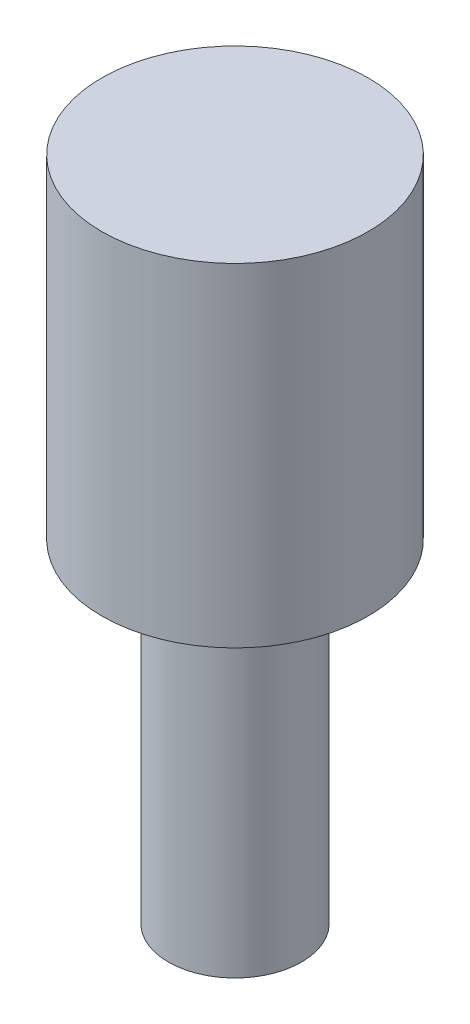
ISO-10303-21;
HEADER;
FILE_DESCRIPTION(('STEP AP214'),'2;1');
FILE_NAME('part.step','',(''),(''),'','','');
FILE_SCHEMA(('AUTOMOTIVE_DESIGN { 1 0 10303 214 1 1 1 1 }'));
ENDSEC;
DATA;
#1=APPLICATION_CONTEXT('core data for automotive mechanical design processes');
#2=APPLICATION_PROTOCOL_DEFINITION('international standard','automotive_design',2000,#1);
#3=PRODUCT_CONTEXT('',#1,'mechanical');
#4=PRODUCT('Part','Part','',(#3));
#5=PRODUCT_RELATED_PRODUCT_CATEGORY('part','',(#4));
#6=PRODUCT_DEFINITION_FORMATION('','',#4);
#7=PRODUCT_DEFINITION_CONTEXT('part definition',#1,'design');
#8=PRODUCT_DEFINITION('design','',#6,#7);
#9=PRODUCT_DEFINITION_SHAPE('','',#8);
#10=(LENGTH_UNIT() NAMED_UNIT(*) SI_UNIT(.MILLI.,.METRE.));
#11=(NAMED_UNIT(*) PLANE_ANGLE_UNIT() SI_UNIT($,.RADIAN.));
#12=(NAMED_UNIT(*) SI_UNIT($,.STERADIAN.) SOLID_ANGLE_UNIT());
#13=UNCERTAINTY_MEASURE_WITH_UNIT(LENGTH_MEASURE(1.E-05),#10,'distance_accuracy_value','');
#14=(GEOMETRIC_REPRESENTATION_CONTEXT(3) GLOBAL_UNCERTAINTY_ASSIGNED_CONTEXT((#13)) GLOBAL_UNIT_ASSIGNED_CONTEXT((#10,
#11,#12)) REPRESENTATION_CONTEXT('',''));
#15=CARTESIAN_POINT('',(0.,0.,0.));
#16=DIRECTION('',(0.,0.,1.));
#17=DIRECTION('',(1.,0.,0.));
#18=AXIS2_PLACEMENT_3D('',#15,#16,#17);
#19=CARTESIAN_POINT('',(0.,10.,0.));
#20=DIRECTION('',(0.,-1.,0.));
#21=DIRECTION('',(0.,0.,-1.));
#22=AXIS2_PLACEMENT_3D('',#19,#20,#21);
#23=CYLINDRICAL_SURFACE('',#22,2.);
#24=CARTESIAN_POINT('',(0.,10.,0.));
#25=DIRECTION('',(0.,1.,0.));
#26=DIRECTION('',(0.,0.,1.));
#27=AXIS2_PLACEMENT_3D('',#24,#25,#26);
#28=CIRCLE('',#27,2.);
#29=CARTESIAN_POINT('',(0.,10.,2.));
#30=VERTEX_POINT('',#29);
#31=EDGE_CURVE('E10',#30,#30,#28,.T.);
#32=ORIENTED_EDGE('',*,*,#31,.F.);
#33=EDGE_LOOP('',(#32));
#34=FACE_BOUND('',#33,.T.);
#35=CARTESIAN_POINT('',(0.,0.,0.));
#36=DIRECTION('',(0.,1.,0.));
#37=DIRECTION('',(0.,0.,1.));
#38=AXIS2_PLACEMENT_3D('',#35,#36,#37);
#39=CIRCLE('',#38,2.);
#40=CARTESIAN_POINT('',(0.,0.,2.));
#41=VERTEX_POINT('',#40);
#42=EDGE_CURVE('E34',#41,#41,#39,.T.);
#43=ORIENTED_EDGE('',*,*,#42,.T.);
#44=EDGE_LOOP('',(#43));
#45=FACE_BOUND('',#44,.T.);
#46=ADVANCED_FACE('F31',(#34,#45),#23,.T.);
#47=CARTESIAN_POINT('',(0.,0.,0.));
#48=DIRECTION('',(0.,1.,0.));
#49=DIRECTION('',(0.,0.,1.));
#50=AXIS2_PLACEMENT_3D('',#47,#48,#49);
#51=PLANE('',#50);
#52=ORIENTED_EDGE('',*,*,#42,.F.);
#53=EDGE_LOOP('',(#52));
#54=FACE_BOUND('',#53,.T.);
#55=ADVANCED_FACE('F59',(#54),#51,.F.);
#56=CARTESIAN_POINT('',(0.,10.,0.));
#57=DIRECTION('',(0.,1.,0.));
#58=DIRECTION('',(0.,0.,1.));
#59=AXIS2_PLACEMENT_3D('',#56,#57,#58);
#60=PLANE('',#59);
#61=CARTESIAN_POINT('',(0.,10.,0.));
#62=DIRECTION('',(0.,1.,0.));
#63=DIRECTION('',(0.,0.,1.));
#64=AXIS2_PLACEMENT_3D('',#61,#62,#63);
#65=CIRCLE('',#64,4.);
#66=CARTESIAN_POINT('',(0.,10.,4.));
#67=VERTEX_POINT('',#66);
#68=EDGE_CURVE('E43',#67,#67,#65,.T.);
#69=ORIENTED_EDGE('',*,*,#68,.F.);
#70=EDGE_LOOP('',(#69));
#71=FACE_BOUND('',#70,.T.);
#72=ORIENTED_EDGE('',*,*,#31,.T.);
#73=EDGE_LOOP('',(#72));
#74=FACE_BOUND('',#73,.T.);
#75=ADVANCED_FACE('F54',(#71,#74),#60,.F.);
#76=CARTESIAN_POINT('',(0.,20.,0.));
#77=DIRECTION('',(0.,-1.,0.));
#78=DIRECTION('',(0.,0.,-1.));
#79=AXIS2_PLACEMENT_3D('',#76,#77,#78);
#80=CYLINDRICAL_SURFACE('',#79,4.);
#81=CARTESIAN_POINT('',(0.,20.,0.));
#82=DIRECTION('',(0.,1.,0.));
#83=DIRECTION('',(0.,0.,1.));
#84=AXIS2_PLACEMENT_3D('',#81,#82,#83);
#85=CIRCLE('',#84,4.);
#86=CARTESIAN_POINT('',(0.,20.,4.));
#87=VERTEX_POINT('',#86);
#88=EDGE_CURVE('E41',#87,#87,#85,.T.);
#89=ORIENTED_EDGE('',*,*,#88,.F.);
#90=EDGE_LOOP('',(#89));
#91=FACE_BOUND('',#90,.T.);
#92=ORIENTED_EDGE('',*,*,#68,.T.);
#93=EDGE_LOOP('',(#92));
#94=FACE_BOUND('',#93,.T.);
#95=ADVANCED_FACE('F51',(#91,#94),#80,.T.);
#96=CARTESIAN_POINT('',(0.,20.,0.));
#97=DIRECTION('',(0.,1.,0.));
#98=DIRECTION('',(0.,0.,1.));
#99=AXIS2_PLACEMENT_3D('',#96,#97,#98);
#100=PLANE('',#99);
#101=ORIENTED_EDGE('',*,*,#88,.T.);
#102=EDGE_LOOP('',(#101));
#103=FACE_BOUND('',#102,.T.);
#104=ADVANCED_FACE('F49',(#103),#100,.T.);
#105=CLOSED_SHELL('',(#46,#55,#75,#95,#104));
#106=MANIFOLD_SOLID_BREP('B2',#105);
#107=ADVANCED_BREP_SHAPE_REPRESENTATION('',(#18,#106),#14);
#108=SHAPE_DEFINITION_REPRESENTATION(#9,#107);
ENDSEC;
END-ISO-10303-21;
